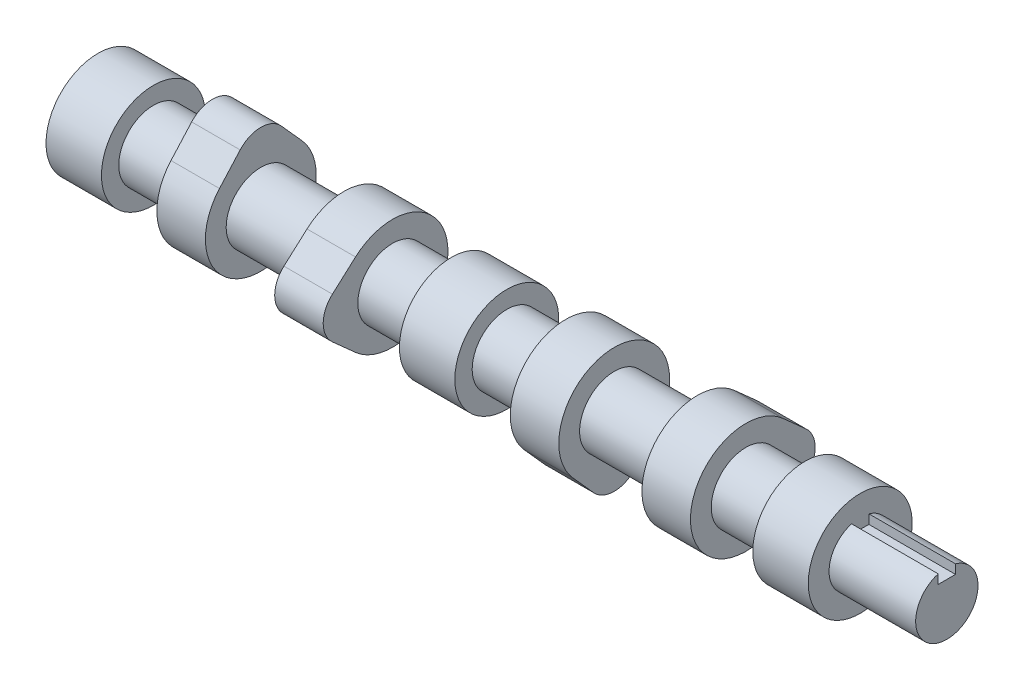
ISO-10303-21;
HEADER;
FILE_DESCRIPTION(('STEP AP214'),'2;1');
FILE_NAME('part.step','',(''),(''),'','','');
FILE_SCHEMA(('AUTOMOTIVE_DESIGN { 1 0 10303 214 1 1 1 1 }'));
ENDSEC;
DATA;
#1=APPLICATION_CONTEXT('core data for automotive mechanical design processes');
#2=APPLICATION_PROTOCOL_DEFINITION('international standard','automotive_design',2000,#1);
#3=PRODUCT_CONTEXT('',#1,'mechanical');
#4=PRODUCT('Part','Part','',(#3));
#5=PRODUCT_RELATED_PRODUCT_CATEGORY('part','',(#4));
#6=PRODUCT_DEFINITION_FORMATION('','',#4);
#7=PRODUCT_DEFINITION_CONTEXT('part definition',#1,'design');
#8=PRODUCT_DEFINITION('design','',#6,#7);
#9=PRODUCT_DEFINITION_SHAPE('','',#8);
#10=(LENGTH_UNIT() NAMED_UNIT(*) SI_UNIT(.MILLI.,.METRE.));
#11=(NAMED_UNIT(*) PLANE_ANGLE_UNIT() SI_UNIT($,.RADIAN.));
#12=(NAMED_UNIT(*) SI_UNIT($,.STERADIAN.) SOLID_ANGLE_UNIT());
#13=UNCERTAINTY_MEASURE_WITH_UNIT(LENGTH_MEASURE(1.E-05),#10,'distance_accuracy_value','');
#14=(GEOMETRIC_REPRESENTATION_CONTEXT(3) GLOBAL_UNCERTAINTY_ASSIGNED_CONTEXT((#13)) GLOBAL_UNIT_ASSIGNED_CONTEXT((#10,
#11,#12)) REPRESENTATION_CONTEXT('',''));
#15=CARTESIAN_POINT('',(0.,0.,0.));
#16=DIRECTION('',(0.,0.,1.));
#17=DIRECTION('',(1.,0.,0.));
#18=AXIS2_PLACEMENT_3D('',#15,#16,#17);
#19=CARTESIAN_POINT('',(245.,0.,9.));
#20=DIRECTION('',(1.,0.,0.));
#21=DIRECTION('',(0.,0.,-1.));
#22=AXIS2_PLACEMENT_3D('',#19,#20,#21);
#23=PLANE('',#22);
#24=DIRECTION('',(0.,0.,-1.));
#25=VECTOR('',#24,1.);
#26=CARTESIAN_POINT('',(245.,6.,-2.5));
#27=LINE('',#26,#25);
#28=CARTESIAN_POINT('',(245.,6.,2.5));
#29=VERTEX_POINT('',#28);
#30=CARTESIAN_POINT('',(245.,6.,-2.5));
#31=VERTEX_POINT('',#30);
#32=EDGE_CURVE('E217',#29,#31,#27,.T.);
#33=ORIENTED_EDGE('',*,*,#32,.F.);
#34=DIRECTION('',(0.,-1.,0.));
#35=VECTOR('',#34,1.);
#36=CARTESIAN_POINT('',(245.,10.,2.5));
#37=LINE('',#36,#35);
#38=CARTESIAN_POINT('',(245.,8.64580823289529,2.5));
#39=VERTEX_POINT('',#38);
#40=EDGE_CURVE('E208',#39,#29,#37,.T.);
#41=ORIENTED_EDGE('',*,*,#40,.F.);
#42=CARTESIAN_POINT('',(245.,0.,0.));
#43=DIRECTION('',(-1.,0.,0.));
#44=DIRECTION('',(0.,0.,1.));
#45=AXIS2_PLACEMENT_3D('',#42,#43,#44);
#46=CIRCLE('',#45,9.);
#47=CARTESIAN_POINT('',(245.,8.64580823289529,-2.5));
#48=VERTEX_POINT('',#47);
#49=EDGE_CURVE('E414',#48,#39,#46,.T.);
#50=ORIENTED_EDGE('',*,*,#49,.F.);
#51=DIRECTION('',(0.,-1.,0.));
#52=VECTOR('',#51,1.);
#53=CARTESIAN_POINT('',(245.,10.,-2.5));
#54=LINE('',#53,#52);
#55=EDGE_CURVE('E62',#48,#31,#54,.T.);
#56=ORIENTED_EDGE('',*,*,#55,.T.);
#57=EDGE_LOOP('',(#33,#41,#50,#56));
#58=FACE_BOUND('',#57,.T.);
#59=ADVANCED_FACE('F45',(#58),#23,.T.);
#60=CARTESIAN_POINT('',(0.,0.,0.));
#61=DIRECTION('',(-1.,0.,0.));
#62=DIRECTION('',(0.,0.,1.));
#63=AXIS2_PLACEMENT_3D('',#60,#61,#62);
#64=CYLINDRICAL_SURFACE('',#63,9.);
#65=ORIENTED_EDGE('',*,*,#49,.T.);
#66=DIRECTION('',(-1.,0.,0.));
#67=VECTOR('',#66,1.);
#68=CARTESIAN_POINT('',(0.,8.64580823289529,2.5));
#69=LINE('',#68,#67);
#70=CARTESIAN_POINT('',(220.,8.64580823289529,2.5));
#71=VERTEX_POINT('',#70);
#72=EDGE_CURVE('E240',#39,#71,#69,.T.);
#73=ORIENTED_EDGE('',*,*,#72,.T.);
#74=CARTESIAN_POINT('',(220.,0.,0.));
#75=DIRECTION('',(-1.,0.,0.));
#76=DIRECTION('',(0.,0.,1.));
#77=AXIS2_PLACEMENT_3D('',#74,#75,#76);
#78=CIRCLE('',#77,9.);
#79=CARTESIAN_POINT('',(220.,8.64580823289529,-2.5));
#80=VERTEX_POINT('',#79);
#81=EDGE_CURVE('E203',#80,#71,#78,.T.);
#82=ORIENTED_EDGE('',*,*,#81,.F.);
#83=DIRECTION('',(-1.,0.,0.));
#84=VECTOR('',#83,1.);
#85=CARTESIAN_POINT('',(0.,8.64580823289529,-2.5));
#86=LINE('',#85,#84);
#87=EDGE_CURVE('E207',#80,#48,#86,.F.);
#88=ORIENTED_EDGE('',*,*,#87,.T.);
#89=EDGE_LOOP('',(#65,#73,#82,#88));
#90=FACE_BOUND('',#89,.T.);
#91=ADVANCED_FACE('F518',(#90),#64,.T.);
#92=CARTESIAN_POINT('',(0.,0.,0.));
#93=DIRECTION('',(-1.,0.,0.));
#94=DIRECTION('',(0.,0.,1.));
#95=AXIS2_PLACEMENT_3D('',#92,#93,#94);
#96=CYLINDRICAL_SURFACE('',#95,10.);
#97=CARTESIAN_POINT('',(102.,0.,0.));
#98=DIRECTION('',(-1.,0.,0.));
#99=DIRECTION('',(0.,0.,1.));
#100=AXIS2_PLACEMENT_3D('',#97,#98,#99);
#101=CIRCLE('',#100,10.);
#102=CARTESIAN_POINT('',(102.,0.,10.));
#103=VERTEX_POINT('',#102);
#104=EDGE_CURVE('E444',#103,#103,#101,.T.);
#105=ORIENTED_EDGE('',*,*,#104,.T.);
#106=EDGE_LOOP('',(#105));
#107=FACE_BOUND('',#106,.T.);
#108=CARTESIAN_POINT('',(85.,0.,0.));
#109=DIRECTION('',(-1.,0.,0.));
#110=DIRECTION('',(0.,0.,1.));
#111=AXIS2_PLACEMENT_3D('',#108,#109,#110);
#112=CIRCLE('',#111,10.);
#113=CARTESIAN_POINT('',(85.,0.,10.));
#114=VERTEX_POINT('',#113);
#115=EDGE_CURVE('E378',#114,#114,#112,.F.);
#116=ORIENTED_EDGE('',*,*,#115,.T.);
#117=EDGE_LOOP('',(#116));
#118=FACE_BOUND('',#117,.T.);
#119=ADVANCED_FACE('F523',(#107,#118),#96,.T.);
#120=CARTESIAN_POINT('',(102.,0.,10.));
#121=DIRECTION('',(-1.,0.,0.));
#122=DIRECTION('',(0.,0.,1.));
#123=AXIS2_PLACEMENT_3D('',#120,#121,#122);
#124=PLANE('',#123);
#125=CARTESIAN_POINT('',(102.,0.,0.));
#126=DIRECTION('',(-1.,0.,0.));
#127=DIRECTION('',(0.,0.,1.));
#128=AXIS2_PLACEMENT_3D('',#125,#126,#127);
#129=CIRCLE('',#128,15.);
#130=CARTESIAN_POINT('',(102.,0.,15.));
#131=VERTEX_POINT('',#130);
#132=EDGE_CURVE('E440',#131,#131,#129,.T.);
#133=ORIENTED_EDGE('',*,*,#132,.T.);
#134=EDGE_LOOP('',(#133));
#135=FACE_BOUND('',#134,.T.);
#136=ORIENTED_EDGE('',*,*,#104,.F.);
#137=EDGE_LOOP('',(#136));
#138=FACE_BOUND('',#137,.T.);
#139=ADVANCED_FACE('F551',(#135,#138),#124,.T.);
#140=CARTESIAN_POINT('',(0.,0.,0.));
#141=DIRECTION('',(-1.,0.,0.));
#142=DIRECTION('',(0.,0.,1.));
#143=AXIS2_PLACEMENT_3D('',#140,#141,#142);
#144=CYLINDRICAL_SURFACE('',#143,15.);
#145=CARTESIAN_POINT('',(118.,0.,0.));
#146=DIRECTION('',(-1.,0.,0.));
#147=DIRECTION('',(0.,0.,1.));
#148=AXIS2_PLACEMENT_3D('',#145,#146,#147);
#149=CIRCLE('',#148,15.);
#150=CARTESIAN_POINT('',(118.,0.,15.));
#151=VERTEX_POINT('',#150);
#152=EDGE_CURVE('E436',#151,#151,#149,.T.);
#153=ORIENTED_EDGE('',*,*,#152,.T.);
#154=EDGE_LOOP('',(#153));
#155=FACE_BOUND('',#154,.T.);
#156=ORIENTED_EDGE('',*,*,#132,.F.);
#157=EDGE_LOOP('',(#156));
#158=FACE_BOUND('',#157,.T.);
#159=ADVANCED_FACE('F547',(#155,#158),#144,.T.);
#160=CARTESIAN_POINT('',(118.,0.,15.));
#161=DIRECTION('',(1.,0.,0.));
#162=DIRECTION('',(0.,0.,-1.));
#163=AXIS2_PLACEMENT_3D('',#160,#161,#162);
#164=PLANE('',#163);
#165=CARTESIAN_POINT('',(118.,0.,0.));
#166=DIRECTION('',(-1.,0.,0.));
#167=DIRECTION('',(0.,0.,1.));
#168=AXIS2_PLACEMENT_3D('',#165,#166,#167);
#169=CIRCLE('',#168,10.);
#170=CARTESIAN_POINT('',(118.,0.,10.));
#171=VERTEX_POINT('',#170);
#172=EDGE_CURVE('E432',#171,#171,#169,.T.);
#173=ORIENTED_EDGE('',*,*,#172,.T.);
#174=EDGE_LOOP('',(#173));
#175=FACE_BOUND('',#174,.T.);
#176=ORIENTED_EDGE('',*,*,#152,.F.);
#177=EDGE_LOOP('',(#176));
#178=FACE_BOUND('',#177,.T.);
#179=ADVANCED_FACE('F543',(#175,#178),#164,.T.);
#180=CARTESIAN_POINT('',(0.,0.,0.));
#181=DIRECTION('',(-1.,0.,0.));
#182=DIRECTION('',(0.,0.,1.));
#183=AXIS2_PLACEMENT_3D('',#180,#181,#182);
#184=CYLINDRICAL_SURFACE('',#183,10.);
#185=CARTESIAN_POINT('',(135.,0.,0.));
#186=DIRECTION('',(-1.,0.,0.));
#187=DIRECTION('',(0.,0.,1.));
#188=AXIS2_PLACEMENT_3D('',#185,#186,#187);
#189=CIRCLE('',#188,10.);
#190=CARTESIAN_POINT('',(135.,0.,10.));
#191=VERTEX_POINT('',#190);
#192=EDGE_CURVE('E55',#191,#191,#189,.F.);
#193=ORIENTED_EDGE('',*,*,#192,.F.);
#194=EDGE_LOOP('',(#193));
#195=FACE_BOUND('',#194,.T.);
#196=ORIENTED_EDGE('',*,*,#172,.F.);
#197=EDGE_LOOP('',(#196));
#198=FACE_BOUND('',#197,.T.);
#199=ADVANCED_FACE('F514',(#195,#198),#184,.T.);
#200=CARTESIAN_POINT('',(85.,0.,0.));
#201=DIRECTION('',(-1.,0.,0.));
#202=DIRECTION('',(0.,0.,1.));
#203=AXIS2_PLACEMENT_3D('',#200,#201,#202);
#204=CYLINDRICAL_SURFACE('',#203,16.);
#205=CARTESIAN_POINT('',(71.,0.,0.));
#206=DIRECTION('',(1.,0.,0.));
#207=DIRECTION('',(0.,0.,1.));
#208=AXIS2_PLACEMENT_3D('',#205,#206,#207);
#209=CIRCLE('',#208,16.);
#210=CARTESIAN_POINT('',(71.,-11.9256958799989,10.6666666666667));
#211=VERTEX_POINT('',#210);
#212=CARTESIAN_POINT('',(71.,11.9256958799989,10.6666666666667));
#213=VERTEX_POINT('',#212);
#214=EDGE_CURVE('E351',#211,#213,#209,.T.);
#215=ORIENTED_EDGE('',*,*,#214,.T.);
#216=DIRECTION('',(-1.,0.,0.));
#217=VECTOR('',#216,1.);
#218=CARTESIAN_POINT('',(85.,11.9256958799989,10.6666666666667));
#219=LINE('',#218,#217);
#220=CARTESIAN_POINT('',(85.,11.9256958799989,10.6666666666667));
#221=VERTEX_POINT('',#220);
#222=EDGE_CURVE('E374',#221,#213,#219,.T.);
#223=ORIENTED_EDGE('',*,*,#222,.F.);
#224=CARTESIAN_POINT('',(85.,0.,0.));
#225=DIRECTION('',(1.,0.,0.));
#226=DIRECTION('',(0.,0.,1.));
#227=AXIS2_PLACEMENT_3D('',#224,#225,#226);
#228=CIRCLE('',#227,16.);
#229=CARTESIAN_POINT('',(85.,-11.9256958799989,10.6666666666667));
#230=VERTEX_POINT('',#229);
#231=EDGE_CURVE('E336',#230,#221,#228,.T.);
#232=ORIENTED_EDGE('',*,*,#231,.F.);
#233=DIRECTION('',(-1.,0.,0.));
#234=VECTOR('',#233,1.);
#235=CARTESIAN_POINT('',(85.,-11.9256958799989,10.6666666666667));
#236=LINE('',#235,#234);
#237=EDGE_CURVE('E350',#230,#211,#236,.T.);
#238=ORIENTED_EDGE('',*,*,#237,.T.);
#239=EDGE_LOOP('',(#215,#223,#232,#238));
#240=FACE_BOUND('',#239,.T.);
#241=ADVANCED_FACE('F542',(#240),#204,.T.);
#242=CARTESIAN_POINT('',(85.,5.96284793999944,17.3333333333333));
#243=DIRECTION('',(0.,-0.74535599249993,-0.666666666666667));
#244=DIRECTION('',(0.,0.666666666666667,-0.74535599249993));
#245=AXIS2_PLACEMENT_3D('',#242,#243,#244);
#246=PLANE('',#245);
#247=DIRECTION('',(0.,-0.666666666666667,0.74535599249993));
#248=VECTOR('',#247,1.);
#249=CARTESIAN_POINT('',(71.,5.96284793999944,17.3333333333333));
#250=LINE('',#249,#248);
#251=CARTESIAN_POINT('',(71.,5.96284793999944,17.3333333333333));
#252=VERTEX_POINT('',#251);
#253=EDGE_CURVE('E355',#213,#252,#250,.T.);
#254=ORIENTED_EDGE('',*,*,#253,.T.);
#255=DIRECTION('',(-1.,0.,0.));
#256=VECTOR('',#255,1.);
#257=CARTESIAN_POINT('',(85.,5.96284793999944,17.3333333333333));
#258=LINE('',#257,#256);
#259=CARTESIAN_POINT('',(85.,5.96284793999944,17.3333333333333));
#260=VERTEX_POINT('',#259);
#261=EDGE_CURVE('E370',#260,#252,#258,.T.);
#262=ORIENTED_EDGE('',*,*,#261,.F.);
#263=DIRECTION('',(0.,-0.666666666666667,0.74535599249993));
#264=VECTOR('',#263,1.);
#265=CARTESIAN_POINT('',(85.,5.96284793999944,17.3333333333333));
#266=LINE('',#265,#264);
#267=EDGE_CURVE('E340',#221,#260,#266,.T.);
#268=ORIENTED_EDGE('',*,*,#267,.F.);
#269=ORIENTED_EDGE('',*,*,#222,.T.);
#270=EDGE_LOOP('',(#254,#262,#268,#269));
#271=FACE_BOUND('',#270,.T.);
#272=ADVANCED_FACE('F719',(#271),#246,.F.);
#273=CARTESIAN_POINT('',(85.,0.,12.));
#274=DIRECTION('',(-1.,0.,0.));
#275=DIRECTION('',(0.,0.,1.));
#276=AXIS2_PLACEMENT_3D('',#273,#274,#275);
#277=CYLINDRICAL_SURFACE('',#276,8.);
#278=CARTESIAN_POINT('',(71.,0.,12.));
#279=DIRECTION('',(1.,0.,0.));
#280=DIRECTION('',(0.,0.,1.));
#281=AXIS2_PLACEMENT_3D('',#278,#279,#280);
#282=CIRCLE('',#281,8.);
#283=CARTESIAN_POINT('',(71.,-5.96284793999944,17.3333333333333));
#284=VERTEX_POINT('',#283);
#285=EDGE_CURVE('E358',#252,#284,#282,.T.);
#286=ORIENTED_EDGE('',*,*,#285,.T.);
#287=DIRECTION('',(-1.,0.,0.));
#288=VECTOR('',#287,1.);
#289=CARTESIAN_POINT('',(85.,-5.96284793999944,17.3333333333333));
#290=LINE('',#289,#288);
#291=CARTESIAN_POINT('',(85.,-5.96284793999944,17.3333333333333));
#292=VERTEX_POINT('',#291);
#293=EDGE_CURVE('E366',#292,#284,#290,.T.);
#294=ORIENTED_EDGE('',*,*,#293,.F.);
#295=CARTESIAN_POINT('',(85.,0.,12.));
#296=DIRECTION('',(1.,0.,0.));
#297=DIRECTION('',(0.,0.,1.));
#298=AXIS2_PLACEMENT_3D('',#295,#296,#297);
#299=CIRCLE('',#298,8.);
#300=EDGE_CURVE('E344',#260,#292,#299,.T.);
#301=ORIENTED_EDGE('',*,*,#300,.F.);
#302=ORIENTED_EDGE('',*,*,#261,.T.);
#303=EDGE_LOOP('',(#286,#294,#301,#302));
#304=FACE_BOUND('',#303,.T.);
#305=ADVANCED_FACE('F726',(#304),#277,.T.);
#306=CARTESIAN_POINT('',(85.,-11.9256958799989,10.6666666666667));
#307=DIRECTION('',(0.,0.74535599249993,-0.666666666666667));
#308=DIRECTION('',(0.,0.666666666666667,0.74535599249993));
#309=AXIS2_PLACEMENT_3D('',#306,#307,#308);
#310=PLANE('',#309);
#311=DIRECTION('',(0.,-0.666666666666667,-0.74535599249993));
#312=VECTOR('',#311,1.);
#313=CARTESIAN_POINT('',(71.,-11.9256958799989,10.6666666666667));
#314=LINE('',#313,#312);
#315=EDGE_CURVE('E341',#284,#211,#314,.T.);
#316=ORIENTED_EDGE('',*,*,#315,.T.);
#317=ORIENTED_EDGE('',*,*,#237,.F.);
#318=DIRECTION('',(0.,-0.666666666666667,-0.74535599249993));
#319=VECTOR('',#318,1.);
#320=CARTESIAN_POINT('',(85.,-11.9256958799989,10.6666666666667));
#321=LINE('',#320,#319);
#322=EDGE_CURVE('E347',#292,#230,#321,.T.);
#323=ORIENTED_EDGE('',*,*,#322,.F.);
#324=ORIENTED_EDGE('',*,*,#293,.T.);
#325=EDGE_LOOP('',(#316,#317,#323,#324));
#326=FACE_BOUND('',#325,.T.);
#327=ADVANCED_FACE('F733',(#326),#310,.F.);
#328=CARTESIAN_POINT('',(85.,0.,0.));
#329=DIRECTION('',(-1.,0.,0.));
#330=DIRECTION('',(0.,0.,1.));
#331=AXIS2_PLACEMENT_3D('',#328,#329,#330);
#332=PLANE('',#331);
#333=ORIENTED_EDGE('',*,*,#115,.F.);
#334=EDGE_LOOP('',(#333));
#335=FACE_BOUND('',#334,.T.);
#336=ORIENTED_EDGE('',*,*,#231,.T.);
#337=ORIENTED_EDGE('',*,*,#267,.T.);
#338=ORIENTED_EDGE('',*,*,#300,.T.);
#339=ORIENTED_EDGE('',*,*,#322,.T.);
#340=EDGE_LOOP('',(#336,#337,#338,#339));
#341=FACE_BOUND('',#340,.T.);
#342=ADVANCED_FACE('F579',(#335,#341),#332,.F.);
#343=CARTESIAN_POINT('',(71.,0.,0.));
#344=DIRECTION('',(-1.,0.,0.));
#345=DIRECTION('',(0.,0.,1.));
#346=AXIS2_PLACEMENT_3D('',#343,#344,#345);
#347=PLANE('',#346);
#348=CARTESIAN_POINT('',(71.,0.,0.));
#349=DIRECTION('',(-1.,0.,0.));
#350=DIRECTION('',(0.,0.,1.));
#351=AXIS2_PLACEMENT_3D('',#348,#349,#350);
#352=CIRCLE('',#351,10.);
#353=CARTESIAN_POINT('',(71.,0.,10.));
#354=VERTEX_POINT('',#353);
#355=EDGE_CURVE('E463',#354,#354,#352,.F.);
#356=ORIENTED_EDGE('',*,*,#355,.T.);
#357=EDGE_LOOP('',(#356));
#358=FACE_BOUND('',#357,.T.);
#359=ORIENTED_EDGE('',*,*,#214,.F.);
#360=ORIENTED_EDGE('',*,*,#315,.F.);
#361=ORIENTED_EDGE('',*,*,#285,.F.);
#362=ORIENTED_EDGE('',*,*,#253,.F.);
#363=EDGE_LOOP('',(#359,#360,#361,#362));
#364=FACE_BOUND('',#363,.T.);
#365=ADVANCED_FACE('F570',(#358,#364),#347,.T.);
#366=CARTESIAN_POINT('',(0.,0.,0.));
#367=DIRECTION('',(-1.,0.,0.));
#368=DIRECTION('',(0.,0.,1.));
#369=AXIS2_PLACEMENT_3D('',#366,#367,#368);
#370=PLANE('',#369);
#371=CARTESIAN_POINT('',(0.,9.,0.));
#372=DIRECTION('',(1.,0.,0.));
#373=DIRECTION('',(0.,0.,-1.));
#374=AXIS2_PLACEMENT_3D('',#371,#372,#373);
#375=CIRCLE('',#374,2.5);
#376=CARTESIAN_POINT('',(0.,9.,-2.5));
#377=VERTEX_POINT('',#376);
#378=EDGE_CURVE('E243',#377,#377,#375,.T.);
#379=ORIENTED_EDGE('',*,*,#378,.T.);
#380=EDGE_LOOP('',(#379));
#381=FACE_BOUND('',#380,.T.);
#382=CARTESIAN_POINT('',(0.,0.,0.));
#383=DIRECTION('',(-1.,0.,0.));
#384=DIRECTION('',(0.,0.,1.));
#385=AXIS2_PLACEMENT_3D('',#382,#383,#384);
#386=CIRCLE('',#385,15.);
#387=CARTESIAN_POINT('',(0.,0.,15.));
#388=VERTEX_POINT('',#387);
#389=EDGE_CURVE('E455',#388,#388,#386,.T.);
#390=ORIENTED_EDGE('',*,*,#389,.T.);
#391=EDGE_LOOP('',(#390));
#392=FACE_BOUND('',#391,.T.);
#393=ADVANCED_FACE('F47',(#381,#392),#370,.T.);
#394=CARTESIAN_POINT('',(0.,0.,0.));
#395=DIRECTION('',(-1.,0.,0.));
#396=DIRECTION('',(0.,0.,1.));
#397=AXIS2_PLACEMENT_3D('',#394,#395,#396);
#398=CYLINDRICAL_SURFACE('',#397,15.);
#399=CARTESIAN_POINT('',(16.,0.,0.));
#400=DIRECTION('',(-1.,0.,0.));
#401=DIRECTION('',(0.,0.,1.));
#402=AXIS2_PLACEMENT_3D('',#399,#400,#401);
#403=CIRCLE('',#402,15.);
#404=CARTESIAN_POINT('',(16.,0.,15.));
#405=VERTEX_POINT('',#404);
#406=EDGE_CURVE('E451',#405,#405,#403,.T.);
#407=ORIENTED_EDGE('',*,*,#406,.T.);
#408=EDGE_LOOP('',(#407));
#409=FACE_BOUND('',#408,.T.);
#410=ORIENTED_EDGE('',*,*,#389,.F.);
#411=EDGE_LOOP('',(#410));
#412=FACE_BOUND('',#411,.T.);
#413=ADVANCED_FACE('F564',(#409,#412),#398,.T.);
#414=CARTESIAN_POINT('',(16.,0.,15.));
#415=DIRECTION('',(1.,0.,0.));
#416=DIRECTION('',(0.,0.,-1.));
#417=AXIS2_PLACEMENT_3D('',#414,#415,#416);
#418=PLANE('',#417);
#419=CARTESIAN_POINT('',(16.,0.,0.));
#420=DIRECTION('',(-1.,0.,0.));
#421=DIRECTION('',(0.,0.,1.));
#422=AXIS2_PLACEMENT_3D('',#419,#420,#421);
#423=CIRCLE('',#422,10.);
#424=CARTESIAN_POINT('',(16.,0.,10.));
#425=VERTEX_POINT('',#424);
#426=EDGE_CURVE('E448',#425,#425,#423,.T.);
#427=ORIENTED_EDGE('',*,*,#426,.T.);
#428=EDGE_LOOP('',(#427));
#429=FACE_BOUND('',#428,.T.);
#430=ORIENTED_EDGE('',*,*,#406,.F.);
#431=EDGE_LOOP('',(#430));
#432=FACE_BOUND('',#431,.T.);
#433=ADVANCED_FACE('F560',(#429,#432),#418,.T.);
#434=CARTESIAN_POINT('',(33.,0.,0.));
#435=DIRECTION('',(-1.,0.,0.));
#436=DIRECTION('',(0.,0.,1.));
#437=AXIS2_PLACEMENT_3D('',#434,#435,#436);
#438=CIRCLE('',#437,10.);
#439=CARTESIAN_POINT('',(33.,0.,10.));
#440=VERTEX_POINT('',#439);
#441=EDGE_CURVE('E459',#440,#440,#438,.F.);
#442=ORIENTED_EDGE('',*,*,#441,.F.);
#443=EDGE_LOOP('',(#442));
#444=FACE_BOUND('',#443,.T.);
#445=ORIENTED_EDGE('',*,*,#426,.F.);
#446=EDGE_LOOP('',(#445));
#447=FACE_BOUND('',#446,.T.);
#448=ADVANCED_FACE('F556',(#444,#447),#96,.T.);
#449=CARTESIAN_POINT('',(33.,0.,0.));
#450=DIRECTION('',(-1.,0.,0.));
#451=DIRECTION('',(0.,0.,1.));
#452=AXIS2_PLACEMENT_3D('',#449,#450,#451);
#453=PLANE('',#452);
#454=ORIENTED_EDGE('',*,*,#441,.T.);
#455=EDGE_LOOP('',(#454));
#456=FACE_BOUND('',#455,.T.);
#457=CARTESIAN_POINT('',(33.,0.,0.));
#458=DIRECTION('',(1.,0.,0.));
#459=DIRECTION('',(0.,0.,1.));
#460=AXIS2_PLACEMENT_3D('',#457,#458,#459);
#461=CIRCLE('',#460,16.);
#462=CARTESIAN_POINT('',(33.,10.6666666666667,11.9256958799989));
#463=VERTEX_POINT('',#462);
#464=CARTESIAN_POINT('',(33.,10.6666666666667,-11.9256958799989));
#465=VERTEX_POINT('',#464);
#466=EDGE_CURVE('E390',#463,#465,#461,.T.);
#467=ORIENTED_EDGE('',*,*,#466,.F.);
#468=DIRECTION('',(0.,-0.74535599249993,0.666666666666667));
#469=VECTOR('',#468,1.);
#470=CARTESIAN_POINT('',(33.,10.6666666666667,11.9256958799989));
#471=LINE('',#470,#469);
#472=CARTESIAN_POINT('',(33.,17.3333333333333,5.96284793999944));
#473=VERTEX_POINT('',#472);
#474=EDGE_CURVE('E92',#473,#463,#471,.T.);
#475=ORIENTED_EDGE('',*,*,#474,.F.);
#476=CARTESIAN_POINT('',(33.,12.,0.));
#477=DIRECTION('',(1.,0.,0.));
#478=DIRECTION('',(0.,0.,1.));
#479=AXIS2_PLACEMENT_3D('',#476,#477,#478);
#480=CIRCLE('',#479,8.);
#481=CARTESIAN_POINT('',(33.,17.3333333333333,-5.96284793999944));
#482=VERTEX_POINT('',#481);
#483=EDGE_CURVE('E397',#482,#473,#480,.T.);
#484=ORIENTED_EDGE('',*,*,#483,.F.);
#485=DIRECTION('',(0.,0.74535599249993,0.666666666666667));
#486=VECTOR('',#485,1.);
#487=CARTESIAN_POINT('',(33.,17.3333333333333,-5.96284793999944));
#488=LINE('',#487,#486);
#489=EDGE_CURVE('E394',#465,#482,#488,.T.);
#490=ORIENTED_EDGE('',*,*,#489,.F.);
#491=EDGE_LOOP('',(#467,#475,#484,#490));
#492=FACE_BOUND('',#491,.T.);
#493=ADVANCED_FACE('F559',(#456,#492),#453,.T.);
#494=CARTESIAN_POINT('',(47.,10.6666666666667,11.9256958799989));
#495=DIRECTION('',(0.,-0.666666666666667,-0.74535599249993));
#496=DIRECTION('',(0.,0.74535599249993,-0.666666666666667));
#497=AXIS2_PLACEMENT_3D('',#494,#495,#496);
#498=PLANE('',#497);
#499=ORIENTED_EDGE('',*,*,#474,.T.);
#500=DIRECTION('',(-1.,0.,0.));
#501=VECTOR('',#500,1.);
#502=CARTESIAN_POINT('',(47.,10.6666666666667,11.9256958799989));
#503=LINE('',#502,#501);
#504=CARTESIAN_POINT('',(47.,10.6666666666667,11.9256958799989));
#505=VERTEX_POINT('',#504);
#506=EDGE_CURVE('E389',#505,#463,#503,.T.);
#507=ORIENTED_EDGE('',*,*,#506,.F.);
#508=DIRECTION('',(0.,-0.74535599249993,0.666666666666667));
#509=VECTOR('',#508,1.);
#510=CARTESIAN_POINT('',(47.,10.6666666666667,11.9256958799989));
#511=LINE('',#510,#509);
#512=CARTESIAN_POINT('',(47.,17.3333333333333,5.96284793999944));
#513=VERTEX_POINT('',#512);
#514=EDGE_CURVE('E71',#513,#505,#511,.T.);
#515=ORIENTED_EDGE('',*,*,#514,.F.);
#516=DIRECTION('',(-1.,0.,0.));
#517=VECTOR('',#516,1.);
#518=CARTESIAN_POINT('',(47.,17.3333333333333,5.96284793999944));
#519=LINE('',#518,#517);
#520=EDGE_CURVE('E403',#513,#473,#519,.T.);
#521=ORIENTED_EDGE('',*,*,#520,.T.);
#522=EDGE_LOOP('',(#499,#507,#515,#521));
#523=FACE_BOUND('',#522,.T.);
#524=ADVANCED_FACE('F877',(#523),#498,.F.);
#525=CARTESIAN_POINT('',(47.,12.,0.));
#526=DIRECTION('',(-1.,0.,0.));
#527=DIRECTION('',(0.,0.,1.));
#528=AXIS2_PLACEMENT_3D('',#525,#526,#527);
#529=CYLINDRICAL_SURFACE('',#528,8.);
#530=ORIENTED_EDGE('',*,*,#483,.T.);
#531=ORIENTED_EDGE('',*,*,#520,.F.);
#532=CARTESIAN_POINT('',(47.,12.,0.));
#533=DIRECTION('',(1.,0.,0.));
#534=DIRECTION('',(0.,0.,1.));
#535=AXIS2_PLACEMENT_3D('',#532,#533,#534);
#536=CIRCLE('',#535,8.);
#537=CARTESIAN_POINT('',(47.,17.3333333333333,-5.96284793999944));
#538=VERTEX_POINT('',#537);
#539=EDGE_CURVE('E384',#538,#513,#536,.T.);
#540=ORIENTED_EDGE('',*,*,#539,.F.);
#541=DIRECTION('',(-1.,0.,0.));
#542=VECTOR('',#541,1.);
#543=CARTESIAN_POINT('',(47.,17.3333333333333,-5.96284793999944));
#544=LINE('',#543,#542);
#545=EDGE_CURVE('E406',#538,#482,#544,.T.);
#546=ORIENTED_EDGE('',*,*,#545,.T.);
#547=EDGE_LOOP('',(#530,#531,#540,#546));
#548=FACE_BOUND('',#547,.T.);
#549=ADVANCED_FACE('F894',(#548),#529,.T.);
#550=CARTESIAN_POINT('',(47.,17.3333333333333,-5.96284793999944));
#551=DIRECTION('',(0.,-0.666666666666667,0.74535599249993));
#552=DIRECTION('',(0.,-0.74535599249993,-0.666666666666667));
#553=AXIS2_PLACEMENT_3D('',#550,#551,#552);
#554=PLANE('',#553);
#555=ORIENTED_EDGE('',*,*,#489,.T.);
#556=ORIENTED_EDGE('',*,*,#545,.F.);
#557=DIRECTION('',(0.,0.74535599249993,0.666666666666667));
#558=VECTOR('',#557,1.);
#559=CARTESIAN_POINT('',(47.,17.3333333333333,-5.96284793999944));
#560=LINE('',#559,#558);
#561=CARTESIAN_POINT('',(47.,10.6666666666667,-11.9256958799989));
#562=VERTEX_POINT('',#561);
#563=EDGE_CURVE('E100',#562,#538,#560,.T.);
#564=ORIENTED_EDGE('',*,*,#563,.F.);
#565=DIRECTION('',(-1.,0.,0.));
#566=VECTOR('',#565,1.);
#567=CARTESIAN_POINT('',(47.,10.6666666666667,-11.9256958799989));
#568=LINE('',#567,#566);
#569=EDGE_CURVE('E410',#562,#465,#568,.T.);
#570=ORIENTED_EDGE('',*,*,#569,.T.);
#571=EDGE_LOOP('',(#555,#556,#564,#570));
#572=FACE_BOUND('',#571,.T.);
#573=ADVANCED_FACE('F903',(#572),#554,.F.);
#574=CARTESIAN_POINT('',(47.,0.,0.));
#575=DIRECTION('',(-1.,0.,0.));
#576=DIRECTION('',(0.,0.,1.));
#577=AXIS2_PLACEMENT_3D('',#574,#575,#576);
#578=CYLINDRICAL_SURFACE('',#577,16.);
#579=ORIENTED_EDGE('',*,*,#466,.T.);
#580=ORIENTED_EDGE('',*,*,#569,.F.);
#581=CARTESIAN_POINT('',(47.,0.,0.));
#582=DIRECTION('',(1.,0.,0.));
#583=DIRECTION('',(0.,0.,1.));
#584=AXIS2_PLACEMENT_3D('',#581,#582,#583);
#585=CIRCLE('',#584,16.);
#586=EDGE_CURVE('E379',#505,#562,#585,.T.);
#587=ORIENTED_EDGE('',*,*,#586,.F.);
#588=ORIENTED_EDGE('',*,*,#506,.T.);
#589=EDGE_LOOP('',(#579,#580,#587,#588));
#590=FACE_BOUND('',#589,.T.);
#591=ADVANCED_FACE('F527',(#590),#578,.T.);
#592=CARTESIAN_POINT('',(47.,0.,0.));
#593=DIRECTION('',(-1.,0.,0.));
#594=DIRECTION('',(0.,0.,1.));
#595=AXIS2_PLACEMENT_3D('',#592,#593,#594);
#596=PLANE('',#595);
#597=CARTESIAN_POINT('',(47.,0.,0.));
#598=DIRECTION('',(-1.,0.,0.));
#599=DIRECTION('',(0.,0.,1.));
#600=AXIS2_PLACEMENT_3D('',#597,#598,#599);
#601=CIRCLE('',#600,10.);
#602=CARTESIAN_POINT('',(47.,0.,10.));
#603=VERTEX_POINT('',#602);
#604=EDGE_CURVE('E413',#603,#603,#601,.F.);
#605=ORIENTED_EDGE('',*,*,#604,.F.);
#606=EDGE_LOOP('',(#605));
#607=FACE_BOUND('',#606,.T.);
#608=ORIENTED_EDGE('',*,*,#586,.T.);
#609=ORIENTED_EDGE('',*,*,#563,.T.);
#610=ORIENTED_EDGE('',*,*,#539,.T.);
#611=ORIENTED_EDGE('',*,*,#514,.T.);
#612=EDGE_LOOP('',(#608,#609,#610,#611));
#613=FACE_BOUND('',#612,.T.);
#614=ADVANCED_FACE('F759',(#607,#613),#596,.F.);
#615=ORIENTED_EDGE('',*,*,#355,.F.);
#616=EDGE_LOOP('',(#615));
#617=FACE_BOUND('',#616,.T.);
#618=ORIENTED_EDGE('',*,*,#604,.T.);
#619=EDGE_LOOP('',(#618));
#620=FACE_BOUND('',#619,.T.);
#621=ADVANCED_FACE('F562',(#617,#620),#96,.T.);
#622=CARTESIAN_POINT('',(149.,0.,0.));
#623=DIRECTION('',(-1.,0.,0.));
#624=DIRECTION('',(0.,0.,1.));
#625=AXIS2_PLACEMENT_3D('',#622,#623,#624);
#626=CYLINDRICAL_SURFACE('',#625,16.);
#627=CARTESIAN_POINT('',(135.,0.,0.));
#628=DIRECTION('',(1.,0.,0.));
#629=DIRECTION('',(0.,0.,1.));
#630=AXIS2_PLACEMENT_3D('',#627,#628,#629);
#631=CIRCLE('',#630,16.);
#632=CARTESIAN_POINT('',(135.,-10.6666666666667,-11.9256958799989));
#633=VERTEX_POINT('',#632);
#634=CARTESIAN_POINT('',(135.,-10.6666666666667,11.9256958799989));
#635=VERTEX_POINT('',#634);
#636=EDGE_CURVE('E308',#633,#635,#631,.T.);
#637=ORIENTED_EDGE('',*,*,#636,.T.);
#638=DIRECTION('',(-1.,0.,0.));
#639=VECTOR('',#638,1.);
#640=CARTESIAN_POINT('',(149.,-10.6666666666667,11.9256958799989));
#641=LINE('',#640,#639);
#642=CARTESIAN_POINT('',(149.,-10.6666666666667,11.9256958799989));
#643=VERTEX_POINT('',#642);
#644=EDGE_CURVE('E331',#643,#635,#641,.T.);
#645=ORIENTED_EDGE('',*,*,#644,.F.);
#646=CARTESIAN_POINT('',(149.,0.,0.));
#647=DIRECTION('',(1.,0.,0.));
#648=DIRECTION('',(0.,0.,1.));
#649=AXIS2_PLACEMENT_3D('',#646,#647,#648);
#650=CIRCLE('',#649,16.);
#651=CARTESIAN_POINT('',(149.,-10.6666666666667,-11.9256958799989));
#652=VERTEX_POINT('',#651);
#653=EDGE_CURVE('E293',#652,#643,#650,.T.);
#654=ORIENTED_EDGE('',*,*,#653,.F.);
#655=DIRECTION('',(-1.,0.,0.));
#656=VECTOR('',#655,1.);
#657=CARTESIAN_POINT('',(149.,-10.6666666666667,-11.9256958799989));
#658=LINE('',#657,#656);
#659=EDGE_CURVE('E307',#652,#633,#658,.T.);
#660=ORIENTED_EDGE('',*,*,#659,.T.);
#661=EDGE_LOOP('',(#637,#645,#654,#660));
#662=FACE_BOUND('',#661,.T.);
#663=ADVANCED_FACE('F494',(#662),#626,.T.);
#664=CARTESIAN_POINT('',(149.,-17.3333333333333,5.96284793999944));
#665=DIRECTION('',(0.,0.666666666666667,-0.74535599249993));
#666=DIRECTION('',(0.,0.74535599249993,0.666666666666667));
#667=AXIS2_PLACEMENT_3D('',#664,#665,#666);
#668=PLANE('',#667);
#669=DIRECTION('',(0.,-0.74535599249993,-0.666666666666667));
#670=VECTOR('',#669,1.);
#671=CARTESIAN_POINT('',(135.,-17.3333333333333,5.96284793999944));
#672=LINE('',#671,#670);
#673=CARTESIAN_POINT('',(135.,-17.3333333333333,5.96284793999944));
#674=VERTEX_POINT('',#673);
#675=EDGE_CURVE('E312',#635,#674,#672,.T.);
#676=ORIENTED_EDGE('',*,*,#675,.T.);
#677=DIRECTION('',(-1.,0.,0.));
#678=VECTOR('',#677,1.);
#679=CARTESIAN_POINT('',(149.,-17.3333333333333,5.96284793999944));
#680=LINE('',#679,#678);
#681=CARTESIAN_POINT('',(149.,-17.3333333333333,5.96284793999944));
#682=VERTEX_POINT('',#681);
#683=EDGE_CURVE('E327',#682,#674,#680,.T.);
#684=ORIENTED_EDGE('',*,*,#683,.F.);
#685=DIRECTION('',(0.,-0.74535599249993,-0.666666666666667));
#686=VECTOR('',#685,1.);
#687=CARTESIAN_POINT('',(149.,-17.3333333333333,5.96284793999944));
#688=LINE('',#687,#686);
#689=EDGE_CURVE('E297',#643,#682,#688,.T.);
#690=ORIENTED_EDGE('',*,*,#689,.F.);
#691=ORIENTED_EDGE('',*,*,#644,.T.);
#692=EDGE_LOOP('',(#676,#684,#690,#691));
#693=FACE_BOUND('',#692,.T.);
#694=ADVANCED_FACE('F497',(#693),#668,.F.);
#695=CARTESIAN_POINT('',(149.,-12.,0.));
#696=DIRECTION('',(-1.,0.,0.));
#697=DIRECTION('',(0.,0.,1.));
#698=AXIS2_PLACEMENT_3D('',#695,#696,#697);
#699=CYLINDRICAL_SURFACE('',#698,8.);
#700=CARTESIAN_POINT('',(135.,-12.,0.));
#701=DIRECTION('',(1.,0.,0.));
#702=DIRECTION('',(0.,0.,1.));
#703=AXIS2_PLACEMENT_3D('',#700,#701,#702);
#704=CIRCLE('',#703,8.);
#705=CARTESIAN_POINT('',(135.,-17.3333333333333,-5.96284793999944));
#706=VERTEX_POINT('',#705);
#707=EDGE_CURVE('E315',#674,#706,#704,.T.);
#708=ORIENTED_EDGE('',*,*,#707,.T.);
#709=DIRECTION('',(-1.,0.,0.));
#710=VECTOR('',#709,1.);
#711=CARTESIAN_POINT('',(149.,-17.3333333333333,-5.96284793999944));
#712=LINE('',#711,#710);
#713=CARTESIAN_POINT('',(149.,-17.3333333333333,-5.96284793999944));
#714=VERTEX_POINT('',#713);
#715=EDGE_CURVE('E323',#714,#706,#712,.T.);
#716=ORIENTED_EDGE('',*,*,#715,.F.);
#717=CARTESIAN_POINT('',(149.,-12.,0.));
#718=DIRECTION('',(1.,0.,0.));
#719=DIRECTION('',(0.,0.,1.));
#720=AXIS2_PLACEMENT_3D('',#717,#718,#719);
#721=CIRCLE('',#720,8.);
#722=EDGE_CURVE('E301',#682,#714,#721,.T.);
#723=ORIENTED_EDGE('',*,*,#722,.F.);
#724=ORIENTED_EDGE('',*,*,#683,.T.);
#725=EDGE_LOOP('',(#708,#716,#723,#724));
#726=FACE_BOUND('',#725,.T.);
#727=ADVANCED_FACE('F502',(#726),#699,.T.);
#728=CARTESIAN_POINT('',(149.,-10.6666666666667,-11.9256958799989));
#729=DIRECTION('',(0.,0.666666666666667,0.74535599249993));
#730=DIRECTION('',(0.,-0.74535599249993,0.666666666666667));
#731=AXIS2_PLACEMENT_3D('',#728,#729,#730);
#732=PLANE('',#731);
#733=DIRECTION('',(0.,0.74535599249993,-0.666666666666667));
#734=VECTOR('',#733,1.);
#735=CARTESIAN_POINT('',(135.,-10.6666666666667,-11.9256958799989));
#736=LINE('',#735,#734);
#737=EDGE_CURVE('E298',#706,#633,#736,.T.);
#738=ORIENTED_EDGE('',*,*,#737,.T.);
#739=ORIENTED_EDGE('',*,*,#659,.F.);
#740=DIRECTION('',(0.,0.74535599249993,-0.666666666666667));
#741=VECTOR('',#740,1.);
#742=CARTESIAN_POINT('',(149.,-10.6666666666667,-11.9256958799989));
#743=LINE('',#742,#741);
#744=EDGE_CURVE('E304',#714,#652,#743,.T.);
#745=ORIENTED_EDGE('',*,*,#744,.F.);
#746=ORIENTED_EDGE('',*,*,#715,.T.);
#747=EDGE_LOOP('',(#738,#739,#745,#746));
#748=FACE_BOUND('',#747,.T.);
#749=ADVANCED_FACE('F486',(#748),#732,.F.);
#750=CARTESIAN_POINT('',(149.,0.,0.));
#751=DIRECTION('',(-1.,0.,0.));
#752=DIRECTION('',(0.,0.,1.));
#753=AXIS2_PLACEMENT_3D('',#750,#751,#752);
#754=PLANE('',#753);
#755=CARTESIAN_POINT('',(149.,0.,0.));
#756=DIRECTION('',(-1.,0.,0.));
#757=DIRECTION('',(0.,0.,1.));
#758=AXIS2_PLACEMENT_3D('',#755,#756,#757);
#759=CIRCLE('',#758,10.);
#760=CARTESIAN_POINT('',(149.,0.,10.));
#761=VERTEX_POINT('',#760);
#762=EDGE_CURVE('E335',#761,#761,#759,.F.);
#763=ORIENTED_EDGE('',*,*,#762,.F.);
#764=EDGE_LOOP('',(#763));
#765=FACE_BOUND('',#764,.T.);
#766=ORIENTED_EDGE('',*,*,#653,.T.);
#767=ORIENTED_EDGE('',*,*,#689,.T.);
#768=ORIENTED_EDGE('',*,*,#722,.T.);
#769=ORIENTED_EDGE('',*,*,#744,.T.);
#770=EDGE_LOOP('',(#766,#767,#768,#769));
#771=FACE_BOUND('',#770,.T.);
#772=ADVANCED_FACE('F482',(#765,#771),#754,.F.);
#773=CARTESIAN_POINT('',(135.,0.,0.));
#774=DIRECTION('',(-1.,0.,0.));
#775=DIRECTION('',(0.,0.,1.));
#776=AXIS2_PLACEMENT_3D('',#773,#774,#775);
#777=PLANE('',#776);
#778=ORIENTED_EDGE('',*,*,#192,.T.);
#779=EDGE_LOOP('',(#778));
#780=FACE_BOUND('',#779,.T.);
#781=ORIENTED_EDGE('',*,*,#636,.F.);
#782=ORIENTED_EDGE('',*,*,#737,.F.);
#783=ORIENTED_EDGE('',*,*,#707,.F.);
#784=ORIENTED_EDGE('',*,*,#675,.F.);
#785=EDGE_LOOP('',(#781,#782,#783,#784));
#786=FACE_BOUND('',#785,.T.);
#787=ADVANCED_FACE('F485',(#780,#786),#777,.T.);
#788=CARTESIAN_POINT('',(173.,0.,0.));
#789=DIRECTION('',(-1.,0.,0.));
#790=DIRECTION('',(0.,0.,1.));
#791=AXIS2_PLACEMENT_3D('',#788,#789,#790);
#792=CIRCLE('',#791,10.);
#793=CARTESIAN_POINT('',(173.,0.,10.));
#794=VERTEX_POINT('',#793);
#795=EDGE_CURVE('E11',#794,#794,#792,.F.);
#796=ORIENTED_EDGE('',*,*,#795,.F.);
#797=EDGE_LOOP('',(#796));
#798=FACE_BOUND('',#797,.T.);
#799=ORIENTED_EDGE('',*,*,#762,.T.);
#800=EDGE_LOOP('',(#799));
#801=FACE_BOUND('',#800,.T.);
#802=ADVANCED_FACE('F480',(#798,#801),#184,.T.);
#803=CARTESIAN_POINT('',(187.,0.,0.));
#804=DIRECTION('',(-1.,0.,0.));
#805=DIRECTION('',(0.,0.,1.));
#806=AXIS2_PLACEMENT_3D('',#803,#804,#805);
#807=CYLINDRICAL_SURFACE('',#806,16.);
#808=CARTESIAN_POINT('',(173.,0.,0.));
#809=DIRECTION('',(1.,0.,0.));
#810=DIRECTION('',(0.,0.,1.));
#811=AXIS2_PLACEMENT_3D('',#808,#809,#810);
#812=CIRCLE('',#811,16.);
#813=CARTESIAN_POINT('',(173.,11.9256958799989,-10.6666666666667));
#814=VERTEX_POINT('',#813);
#815=CARTESIAN_POINT('',(173.,-11.9256958799989,-10.6666666666667));
#816=VERTEX_POINT('',#815);
#817=EDGE_CURVE('E248',#814,#816,#812,.T.);
#818=ORIENTED_EDGE('',*,*,#817,.T.);
#819=DIRECTION('',(-1.,0.,0.));
#820=VECTOR('',#819,1.);
#821=CARTESIAN_POINT('',(187.,-11.9256958799989,-10.6666666666667));
#822=LINE('',#821,#820);
#823=CARTESIAN_POINT('',(187.,-11.9256958799989,-10.6666666666667));
#824=VERTEX_POINT('',#823);
#825=EDGE_CURVE('E289',#824,#816,#822,.T.);
#826=ORIENTED_EDGE('',*,*,#825,.F.);
#827=CARTESIAN_POINT('',(187.,0.,0.));
#828=DIRECTION('',(1.,0.,0.));
#829=DIRECTION('',(0.,0.,1.));
#830=AXIS2_PLACEMENT_3D('',#827,#828,#829);
#831=CIRCLE('',#830,16.);
#832=CARTESIAN_POINT('',(187.,11.9256958799989,-10.6666666666667));
#833=VERTEX_POINT('',#832);
#834=EDGE_CURVE('E252',#833,#824,#831,.T.);
#835=ORIENTED_EDGE('',*,*,#834,.F.);
#836=DIRECTION('',(-1.,0.,0.));
#837=VECTOR('',#836,1.);
#838=CARTESIAN_POINT('',(187.,11.9256958799989,-10.6666666666667));
#839=LINE('',#838,#837);
#840=EDGE_CURVE('E266',#833,#814,#839,.T.);
#841=ORIENTED_EDGE('',*,*,#840,.T.);
#842=EDGE_LOOP('',(#818,#826,#835,#841));
#843=FACE_BOUND('',#842,.T.);
#844=ADVANCED_FACE('F511',(#843),#807,.T.);
#845=CARTESIAN_POINT('',(187.,-5.96284793999944,-17.3333333333333));
#846=DIRECTION('',(0.,0.74535599249993,0.666666666666667));
#847=DIRECTION('',(0.,-0.666666666666667,0.74535599249993));
#848=AXIS2_PLACEMENT_3D('',#845,#846,#847);
#849=PLANE('',#848);
#850=DIRECTION('',(0.,0.666666666666667,-0.74535599249993));
#851=VECTOR('',#850,1.);
#852=CARTESIAN_POINT('',(173.,-5.96284793999944,-17.3333333333333));
#853=LINE('',#852,#851);
#854=CARTESIAN_POINT('',(173.,-5.96284793999944,-17.3333333333333));
#855=VERTEX_POINT('',#854);
#856=EDGE_CURVE('E270',#816,#855,#853,.T.);
#857=ORIENTED_EDGE('',*,*,#856,.T.);
#858=DIRECTION('',(-1.,0.,0.));
#859=VECTOR('',#858,1.);
#860=CARTESIAN_POINT('',(187.,-5.96284793999944,-17.3333333333333));
#861=LINE('',#860,#859);
#862=CARTESIAN_POINT('',(187.,-5.96284793999944,-17.3333333333333));
#863=VERTEX_POINT('',#862);
#864=EDGE_CURVE('E285',#863,#855,#861,.T.);
#865=ORIENTED_EDGE('',*,*,#864,.F.);
#866=DIRECTION('',(0.,0.666666666666667,-0.74535599249993));
#867=VECTOR('',#866,1.);
#868=CARTESIAN_POINT('',(187.,-5.96284793999944,-17.3333333333333));
#869=LINE('',#868,#867);
#870=EDGE_CURVE('E256',#824,#863,#869,.T.);
#871=ORIENTED_EDGE('',*,*,#870,.F.);
#872=ORIENTED_EDGE('',*,*,#825,.T.);
#873=EDGE_LOOP('',(#857,#865,#871,#872));
#874=FACE_BOUND('',#873,.T.);
#875=ADVANCED_FACE('F611',(#874),#849,.F.);
#876=CARTESIAN_POINT('',(187.,0.,-12.));
#877=DIRECTION('',(-1.,0.,0.));
#878=DIRECTION('',(0.,0.,1.));
#879=AXIS2_PLACEMENT_3D('',#876,#877,#878);
#880=CYLINDRICAL_SURFACE('',#879,8.);
#881=CARTESIAN_POINT('',(173.,0.,-12.));
#882=DIRECTION('',(1.,0.,0.));
#883=DIRECTION('',(0.,0.,1.));
#884=AXIS2_PLACEMENT_3D('',#881,#882,#883);
#885=CIRCLE('',#884,8.);
#886=CARTESIAN_POINT('',(173.,5.96284793999944,-17.3333333333333));
#887=VERTEX_POINT('',#886);
#888=EDGE_CURVE('E273',#855,#887,#885,.T.);
#889=ORIENTED_EDGE('',*,*,#888,.T.);
#890=DIRECTION('',(-1.,0.,0.));
#891=VECTOR('',#890,1.);
#892=CARTESIAN_POINT('',(187.,5.96284793999944,-17.3333333333333));
#893=LINE('',#892,#891);
#894=CARTESIAN_POINT('',(187.,5.96284793999944,-17.3333333333333));
#895=VERTEX_POINT('',#894);
#896=EDGE_CURVE('E281',#895,#887,#893,.T.);
#897=ORIENTED_EDGE('',*,*,#896,.F.);
#898=CARTESIAN_POINT('',(187.,0.,-12.));
#899=DIRECTION('',(1.,0.,0.));
#900=DIRECTION('',(0.,0.,1.));
#901=AXIS2_PLACEMENT_3D('',#898,#899,#900);
#902=CIRCLE('',#901,8.);
#903=EDGE_CURVE('E260',#863,#895,#902,.T.);
#904=ORIENTED_EDGE('',*,*,#903,.F.);
#905=ORIENTED_EDGE('',*,*,#864,.T.);
#906=EDGE_LOOP('',(#889,#897,#904,#905));
#907=FACE_BOUND('',#906,.T.);
#908=ADVANCED_FACE('F607',(#907),#880,.T.);
#909=CARTESIAN_POINT('',(187.,11.9256958799989,-10.6666666666667));
#910=DIRECTION('',(0.,-0.74535599249993,0.666666666666667));
#911=DIRECTION('',(0.,-0.666666666666667,-0.74535599249993));
#912=AXIS2_PLACEMENT_3D('',#909,#910,#911);
#913=PLANE('',#912);
#914=DIRECTION('',(0.,0.666666666666667,0.74535599249993));
#915=VECTOR('',#914,1.);
#916=CARTESIAN_POINT('',(173.,11.9256958799989,-10.6666666666667));
#917=LINE('',#916,#915);
#918=EDGE_CURVE('E257',#887,#814,#917,.T.);
#919=ORIENTED_EDGE('',*,*,#918,.T.);
#920=ORIENTED_EDGE('',*,*,#840,.F.);
#921=DIRECTION('',(0.,0.666666666666667,0.74535599249993));
#922=VECTOR('',#921,1.);
#923=CARTESIAN_POINT('',(187.,11.9256958799989,-10.6666666666667));
#924=LINE('',#923,#922);
#925=EDGE_CURVE('E263',#895,#833,#924,.T.);
#926=ORIENTED_EDGE('',*,*,#925,.F.);
#927=ORIENTED_EDGE('',*,*,#896,.T.);
#928=EDGE_LOOP('',(#919,#920,#926,#927));
#929=FACE_BOUND('',#928,.T.);
#930=ADVANCED_FACE('F600',(#929),#913,.F.);
#931=CARTESIAN_POINT('',(187.,0.,0.));
#932=DIRECTION('',(-1.,0.,0.));
#933=DIRECTION('',(0.,0.,1.));
#934=AXIS2_PLACEMENT_3D('',#931,#932,#933);
#935=PLANE('',#934);
#936=CARTESIAN_POINT('',(187.,0.,0.));
#937=DIRECTION('',(-1.,0.,0.));
#938=DIRECTION('',(0.,0.,1.));
#939=AXIS2_PLACEMENT_3D('',#936,#937,#938);
#940=CIRCLE('',#939,10.);
#941=CARTESIAN_POINT('',(187.,0.,10.));
#942=VERTEX_POINT('',#941);
#943=EDGE_CURVE('E49',#942,#942,#940,.F.);
#944=ORIENTED_EDGE('',*,*,#943,.F.);
#945=EDGE_LOOP('',(#944));
#946=FACE_BOUND('',#945,.T.);
#947=ORIENTED_EDGE('',*,*,#834,.T.);
#948=ORIENTED_EDGE('',*,*,#870,.T.);
#949=ORIENTED_EDGE('',*,*,#903,.T.);
#950=ORIENTED_EDGE('',*,*,#925,.T.);
#951=EDGE_LOOP('',(#947,#948,#949,#950));
#952=FACE_BOUND('',#951,.T.);
#953=ADVANCED_FACE('F597',(#946,#952),#935,.F.);
#954=CARTESIAN_POINT('',(173.,0.,0.));
#955=DIRECTION('',(-1.,0.,0.));
#956=DIRECTION('',(0.,0.,1.));
#957=AXIS2_PLACEMENT_3D('',#954,#955,#956);
#958=PLANE('',#957);
#959=ORIENTED_EDGE('',*,*,#795,.T.);
#960=EDGE_LOOP('',(#959));
#961=FACE_BOUND('',#960,.T.);
#962=ORIENTED_EDGE('',*,*,#817,.F.);
#963=ORIENTED_EDGE('',*,*,#918,.F.);
#964=ORIENTED_EDGE('',*,*,#888,.F.);
#965=ORIENTED_EDGE('',*,*,#856,.F.);
#966=EDGE_LOOP('',(#962,#963,#964,#965));
#967=FACE_BOUND('',#966,.T.);
#968=ADVANCED_FACE('F533',(#961,#967),#958,.T.);
#969=CARTESIAN_POINT('',(220.,0.,15.));
#970=DIRECTION('',(1.,0.,0.));
#971=DIRECTION('',(0.,0.,-1.));
#972=AXIS2_PLACEMENT_3D('',#969,#970,#971);
#973=PLANE('',#972);
#974=ORIENTED_EDGE('',*,*,#81,.T.);
#975=DIRECTION('',(0.,-1.,0.));
#976=VECTOR('',#975,1.);
#977=CARTESIAN_POINT('',(220.,10.,2.5));
#978=LINE('',#977,#976);
#979=CARTESIAN_POINT('',(220.,6.,2.5));
#980=VERTEX_POINT('',#979);
#981=EDGE_CURVE('E195',#71,#980,#978,.T.);
#982=ORIENTED_EDGE('',*,*,#981,.T.);
#983=DIRECTION('',(0.,0.,1.));
#984=VECTOR('',#983,1.);
#985=CARTESIAN_POINT('',(220.,6.,2.5));
#986=LINE('',#985,#984);
#987=CARTESIAN_POINT('',(220.,6.,-2.5));
#988=VERTEX_POINT('',#987);
#989=EDGE_CURVE('E201',#988,#980,#986,.T.);
#990=ORIENTED_EDGE('',*,*,#989,.F.);
#991=DIRECTION('',(0.,-1.,0.));
#992=VECTOR('',#991,1.);
#993=CARTESIAN_POINT('',(220.,10.,-2.5));
#994=LINE('',#993,#992);
#995=EDGE_CURVE('E231',#80,#988,#994,.T.);
#996=ORIENTED_EDGE('',*,*,#995,.F.);
#997=EDGE_LOOP('',(#974,#982,#990,#996));
#998=FACE_BOUND('',#997,.T.);
#999=CARTESIAN_POINT('',(220.,0.,0.));
#1000=DIRECTION('',(-1.,0.,0.));
#1001=DIRECTION('',(0.,0.,1.));
#1002=AXIS2_PLACEMENT_3D('',#999,#1000,#1001);
#1003=CIRCLE('',#1002,15.);
#1004=CARTESIAN_POINT('',(220.,0.,15.));
#1005=VERTEX_POINT('',#1004);
#1006=EDGE_CURVE('E420',#1005,#1005,#1003,.T.);
#1007=ORIENTED_EDGE('',*,*,#1006,.F.);
#1008=EDGE_LOOP('',(#1007));
#1009=FACE_BOUND('',#1008,.T.);
#1010=ADVANCED_FACE('F197',(#998,#1009),#973,.T.);
#1011=CARTESIAN_POINT('',(0.,0.,0.));
#1012=DIRECTION('',(-1.,0.,0.));
#1013=DIRECTION('',(0.,0.,1.));
#1014=AXIS2_PLACEMENT_3D('',#1011,#1012,#1013);
#1015=CYLINDRICAL_SURFACE('',#1014,15.);
#1016=ORIENTED_EDGE('',*,*,#1006,.T.);
#1017=EDGE_LOOP('',(#1016));
#1018=FACE_BOUND('',#1017,.T.);
#1019=CARTESIAN_POINT('',(204.,0.,0.));
#1020=DIRECTION('',(-1.,0.,0.));
#1021=DIRECTION('',(0.,0.,1.));
#1022=AXIS2_PLACEMENT_3D('',#1019,#1020,#1021);
#1023=CIRCLE('',#1022,15.);
#1024=CARTESIAN_POINT('',(204.,0.,15.));
#1025=VERTEX_POINT('',#1024);
#1026=EDGE_CURVE('E424',#1025,#1025,#1023,.T.);
#1027=ORIENTED_EDGE('',*,*,#1026,.F.);
#1028=EDGE_LOOP('',(#1027));
#1029=FACE_BOUND('',#1028,.T.);
#1030=ADVANCED_FACE('F532',(#1018,#1029),#1015,.T.);
#1031=CARTESIAN_POINT('',(204.,0.,10.));
#1032=DIRECTION('',(-1.,0.,0.));
#1033=DIRECTION('',(0.,0.,1.));
#1034=AXIS2_PLACEMENT_3D('',#1031,#1032,#1033);
#1035=PLANE('',#1034);
#1036=ORIENTED_EDGE('',*,*,#1026,.T.);
#1037=EDGE_LOOP('',(#1036));
#1038=FACE_BOUND('',#1037,.T.);
#1039=CARTESIAN_POINT('',(204.,0.,0.));
#1040=DIRECTION('',(-1.,0.,0.));
#1041=DIRECTION('',(0.,0.,1.));
#1042=AXIS2_PLACEMENT_3D('',#1039,#1040,#1041);
#1043=CIRCLE('',#1042,10.);
#1044=CARTESIAN_POINT('',(204.,0.,10.));
#1045=VERTEX_POINT('',#1044);
#1046=EDGE_CURVE('E428',#1045,#1045,#1043,.T.);
#1047=ORIENTED_EDGE('',*,*,#1046,.F.);
#1048=EDGE_LOOP('',(#1047));
#1049=FACE_BOUND('',#1048,.T.);
#1050=ADVANCED_FACE('F536',(#1038,#1049),#1035,.T.);
#1051=ORIENTED_EDGE('',*,*,#1046,.T.);
#1052=EDGE_LOOP('',(#1051));
#1053=FACE_BOUND('',#1052,.T.);
#1054=ORIENTED_EDGE('',*,*,#943,.T.);
#1055=EDGE_LOOP('',(#1054));
#1056=FACE_BOUND('',#1055,.T.);
#1057=ADVANCED_FACE('F515',(#1053,#1056),#184,.T.);
#1058=CARTESIAN_POINT('',(8.,9.,0.));
#1059=DIRECTION('',(-1.,0.,0.));
#1060=DIRECTION('',(0.,0.,1.));
#1061=AXIS2_PLACEMENT_3D('',#1058,#1059,#1060);
#1062=CYLINDRICAL_SURFACE('',#1061,2.5);
#1063=CARTESIAN_POINT('',(8.,9.,0.));
#1064=DIRECTION('',(1.,0.,0.));
#1065=DIRECTION('',(0.,0.,-1.));
#1066=AXIS2_PLACEMENT_3D('',#1063,#1064,#1065);
#1067=CIRCLE('',#1066,2.5);
#1068=CARTESIAN_POINT('',(8.,9.,-2.5));
#1069=VERTEX_POINT('',#1068);
#1070=EDGE_CURVE('E244',#1069,#1069,#1067,.T.);
#1071=ORIENTED_EDGE('',*,*,#1070,.T.);
#1072=EDGE_LOOP('',(#1071));
#1073=FACE_BOUND('',#1072,.T.);
#1074=ORIENTED_EDGE('',*,*,#378,.F.);
#1075=EDGE_LOOP('',(#1074));
#1076=FACE_BOUND('',#1075,.T.);
#1077=ADVANCED_FACE('F584',(#1073,#1076),#1062,.F.);
#1078=CARTESIAN_POINT('',(8.,9.,0.));
#1079=DIRECTION('',(1.,0.,0.));
#1080=DIRECTION('',(0.,0.,-1.));
#1081=AXIS2_PLACEMENT_3D('',#1078,#1079,#1080);
#1082=PLANE('',#1081);
#1083=ORIENTED_EDGE('',*,*,#1070,.F.);
#1084=EDGE_LOOP('',(#1083));
#1085=FACE_BOUND('',#1084,.T.);
#1086=ADVANCED_FACE('F586',(#1085),#1082,.F.);
#1087=CARTESIAN_POINT('',(245.,10.,2.5));
#1088=DIRECTION('',(0.,0.,-1.));
#1089=DIRECTION('',(-1.,0.,0.));
#1090=AXIS2_PLACEMENT_3D('',#1087,#1088,#1089);
#1091=PLANE('',#1090);
#1092=ORIENTED_EDGE('',*,*,#40,.T.);
#1093=DIRECTION('',(1.,0.,0.));
#1094=VECTOR('',#1093,1.);
#1095=CARTESIAN_POINT('',(245.,6.,2.5));
#1096=LINE('',#1095,#1094);
#1097=EDGE_CURVE('E211',#980,#29,#1096,.T.);
#1098=ORIENTED_EDGE('',*,*,#1097,.F.);
#1099=ORIENTED_EDGE('',*,*,#981,.F.);
#1100=ORIENTED_EDGE('',*,*,#72,.F.);
#1101=EDGE_LOOP('',(#1092,#1098,#1099,#1100));
#1102=FACE_BOUND('',#1101,.T.);
#1103=ADVANCED_FACE('F212',(#1102),#1091,.T.);
#1104=CARTESIAN_POINT('',(220.,10.,-2.5));
#1105=DIRECTION('',(0.,0.,1.));
#1106=DIRECTION('',(1.,0.,0.));
#1107=AXIS2_PLACEMENT_3D('',#1104,#1105,#1106);
#1108=PLANE('',#1107);
#1109=ORIENTED_EDGE('',*,*,#995,.T.);
#1110=DIRECTION('',(-1.,0.,0.));
#1111=VECTOR('',#1110,1.);
#1112=CARTESIAN_POINT('',(220.,6.,-2.5));
#1113=LINE('',#1112,#1111);
#1114=EDGE_CURVE('E221',#31,#988,#1113,.T.);
#1115=ORIENTED_EDGE('',*,*,#1114,.F.);
#1116=ORIENTED_EDGE('',*,*,#55,.F.);
#1117=ORIENTED_EDGE('',*,*,#87,.F.);
#1118=EDGE_LOOP('',(#1109,#1115,#1116,#1117));
#1119=FACE_BOUND('',#1118,.T.);
#1120=ADVANCED_FACE('F981',(#1119),#1108,.T.);
#1121=CARTESIAN_POINT('',(0.,6.,0.));
#1122=DIRECTION('',(0.,-1.,0.));
#1123=DIRECTION('',(0.,0.,-1.));
#1124=AXIS2_PLACEMENT_3D('',#1121,#1122,#1123);
#1125=PLANE('',#1124);
#1126=ORIENTED_EDGE('',*,*,#989,.T.);
#1127=ORIENTED_EDGE('',*,*,#1097,.T.);
#1128=ORIENTED_EDGE('',*,*,#32,.T.);
#1129=ORIENTED_EDGE('',*,*,#1114,.T.);
#1130=EDGE_LOOP('',(#1126,#1127,#1128,#1129));
#1131=FACE_BOUND('',#1130,.T.);
#1132=ADVANCED_FACE('F220',(#1131),#1125,.F.);
#1133=CLOSED_SHELL('',(#59,#91,#119,#139,#159,#179,#199,#241,#272,#305,#327,#342,#365,#393,#413,
#433,#448,#493,#524,#549,#573,#591,#614,#621,#663,#694,#727,#749,#772,#787,#802,#844,#875,#908,
#930,#953,#968,#1010,#1030,#1050,#1057,#1077,#1086,#1103,#1120,#1132));
#1134=MANIFOLD_SOLID_BREP('B2',#1133);
#1135=ADVANCED_BREP_SHAPE_REPRESENTATION('',(#18,#1134),#14);
#1136=SHAPE_DEFINITION_REPRESENTATION(#9,#1135);
ENDSEC;
END-ISO-10303-21;
